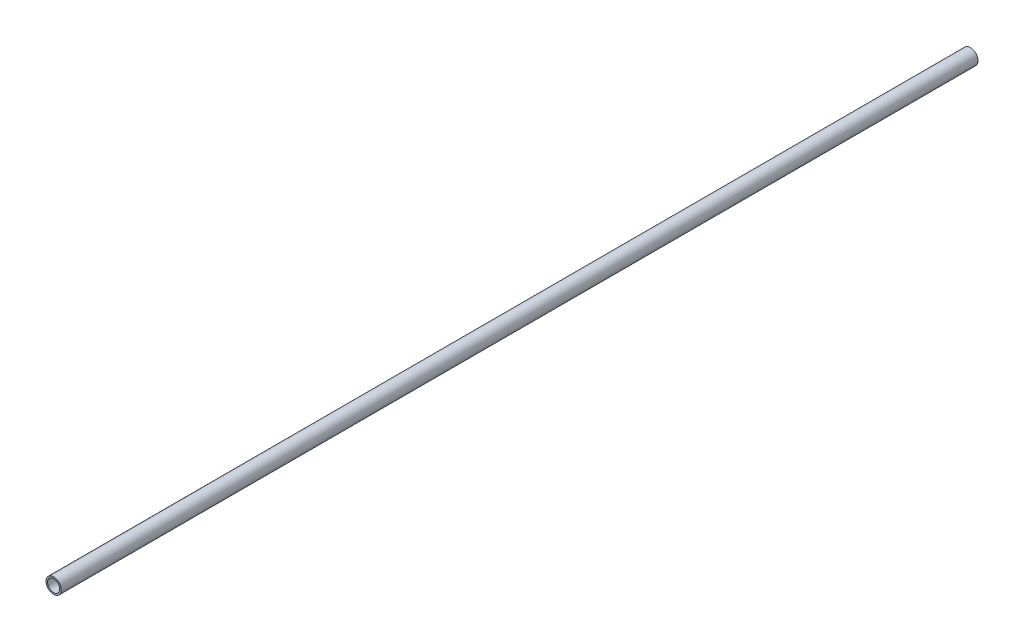
ISO-10303-21;
HEADER;
FILE_DESCRIPTION(('STEP AP214'),'2;1');
FILE_NAME('part.step','',(''),(''),'','','');
FILE_SCHEMA(('AUTOMOTIVE_DESIGN { 1 0 10303 214 1 1 1 1 }'));
ENDSEC;
DATA;
#1=APPLICATION_CONTEXT('core data for automotive mechanical design processes');
#2=APPLICATION_PROTOCOL_DEFINITION('international standard','automotive_design',2000,#1);
#3=PRODUCT_CONTEXT('',#1,'mechanical');
#4=PRODUCT('Part','Part','',(#3));
#5=PRODUCT_RELATED_PRODUCT_CATEGORY('part','',(#4));
#6=PRODUCT_DEFINITION_FORMATION('','',#4);
#7=PRODUCT_DEFINITION_CONTEXT('part definition',#1,'design');
#8=PRODUCT_DEFINITION('design','',#6,#7);
#9=PRODUCT_DEFINITION_SHAPE('','',#8);
#10=(LENGTH_UNIT() NAMED_UNIT(*) SI_UNIT(.MILLI.,.METRE.));
#11=(NAMED_UNIT(*) PLANE_ANGLE_UNIT() SI_UNIT($,.RADIAN.));
#12=(NAMED_UNIT(*) SI_UNIT($,.STERADIAN.) SOLID_ANGLE_UNIT());
#13=UNCERTAINTY_MEASURE_WITH_UNIT(LENGTH_MEASURE(1.E-05),#10,'distance_accuracy_value','');
#14=(GEOMETRIC_REPRESENTATION_CONTEXT(3) GLOBAL_UNCERTAINTY_ASSIGNED_CONTEXT((#13)) GLOBAL_UNIT_ASSIGNED_CONTEXT((#10,
#11,#12)) REPRESENTATION_CONTEXT('',''));
#15=CARTESIAN_POINT('',(0.,0.,0.));
#16=DIRECTION('',(0.,0.,1.));
#17=DIRECTION('',(1.,0.,0.));
#18=AXIS2_PLACEMENT_3D('',#15,#16,#17);
#19=CARTESIAN_POINT('',(0.,0.,600.));
#20=DIRECTION('',(0.,0.,-1.));
#21=DIRECTION('',(-1.,0.,0.));
#22=AXIS2_PLACEMENT_3D('',#19,#20,#21);
#23=CYLINDRICAL_SURFACE('',#22,4.);
#24=CARTESIAN_POINT('',(0.,0.,600.));
#25=DIRECTION('',(0.,0.,1.));
#26=DIRECTION('',(1.,0.,0.));
#27=AXIS2_PLACEMENT_3D('',#24,#25,#26);
#28=CIRCLE('',#27,4.);
#29=CARTESIAN_POINT('',(4.,0.,600.));
#30=VERTEX_POINT('',#29);
#31=EDGE_CURVE('E44',#30,#30,#28,.T.);
#32=ORIENTED_EDGE('',*,*,#31,.T.);
#33=EDGE_LOOP('',(#32));
#34=FACE_BOUND('',#33,.T.);
#35=CARTESIAN_POINT('',(0.,0.,0.));
#36=DIRECTION('',(0.,0.,1.));
#37=DIRECTION('',(1.,0.,0.));
#38=AXIS2_PLACEMENT_3D('',#35,#36,#37);
#39=CIRCLE('',#38,4.);
#40=CARTESIAN_POINT('',(4.,0.,0.));
#41=VERTEX_POINT('',#40);
#42=EDGE_CURVE('E50',#41,#41,#39,.T.);
#43=ORIENTED_EDGE('',*,*,#42,.F.);
#44=EDGE_LOOP('',(#43));
#45=FACE_BOUND('',#44,.T.);
#46=ADVANCED_FACE('F37',(#34,#45),#23,.F.);
#47=CARTESIAN_POINT('',(0.,0.,600.));
#48=DIRECTION('',(0.,0.,-1.));
#49=DIRECTION('',(-1.,0.,0.));
#50=AXIS2_PLACEMENT_3D('',#47,#48,#49);
#51=CYLINDRICAL_SURFACE('',#50,5.);
#52=CARTESIAN_POINT('',(0.,0.,600.));
#53=DIRECTION('',(0.,0.,1.));
#54=DIRECTION('',(1.,0.,0.));
#55=AXIS2_PLACEMENT_3D('',#52,#53,#54);
#56=CIRCLE('',#55,5.);
#57=CARTESIAN_POINT('',(5.,0.,600.));
#58=VERTEX_POINT('',#57);
#59=EDGE_CURVE('E10',#58,#58,#56,.T.);
#60=ORIENTED_EDGE('',*,*,#59,.F.);
#61=EDGE_LOOP('',(#60));
#62=FACE_BOUND('',#61,.T.);
#63=CARTESIAN_POINT('',(0.,0.,0.));
#64=DIRECTION('',(0.,0.,1.));
#65=DIRECTION('',(1.,0.,0.));
#66=AXIS2_PLACEMENT_3D('',#63,#64,#65);
#67=CIRCLE('',#66,5.);
#68=CARTESIAN_POINT('',(5.,0.,0.));
#69=VERTEX_POINT('',#68);
#70=EDGE_CURVE('E40',#69,#69,#67,.T.);
#71=ORIENTED_EDGE('',*,*,#70,.T.);
#72=EDGE_LOOP('',(#71));
#73=FACE_BOUND('',#72,.T.);
#74=ADVANCED_FACE('F57',(#62,#73),#51,.T.);
#75=CARTESIAN_POINT('',(0.,0.,600.));
#76=DIRECTION('',(0.,0.,1.));
#77=DIRECTION('',(1.,0.,0.));
#78=AXIS2_PLACEMENT_3D('',#75,#76,#77);
#79=PLANE('',#78);
#80=ORIENTED_EDGE('',*,*,#31,.F.);
#81=EDGE_LOOP('',(#80));
#82=FACE_BOUND('',#81,.T.);
#83=ORIENTED_EDGE('',*,*,#59,.T.);
#84=EDGE_LOOP('',(#83));
#85=FACE_BOUND('',#84,.T.);
#86=ADVANCED_FACE('F61',(#82,#85),#79,.T.);
#87=CARTESIAN_POINT('',(0.,0.,0.));
#88=DIRECTION('',(0.,0.,1.));
#89=DIRECTION('',(1.,0.,0.));
#90=AXIS2_PLACEMENT_3D('',#87,#88,#89);
#91=PLANE('',#90);
#92=ORIENTED_EDGE('',*,*,#42,.T.);
#93=EDGE_LOOP('',(#92));
#94=FACE_BOUND('',#93,.T.);
#95=ORIENTED_EDGE('',*,*,#70,.F.);
#96=EDGE_LOOP('',(#95));
#97=FACE_BOUND('',#96,.T.);
#98=ADVANCED_FACE('F59',(#94,#97),#91,.F.);
#99=CLOSED_SHELL('',(#46,#74,#86,#98));
#100=MANIFOLD_SOLID_BREP('B2',#99);
#101=ADVANCED_BREP_SHAPE_REPRESENTATION('',(#18,#100),#14);
#102=SHAPE_DEFINITION_REPRESENTATION(#9,#101);
ENDSEC;
END-ISO-10303-21;
